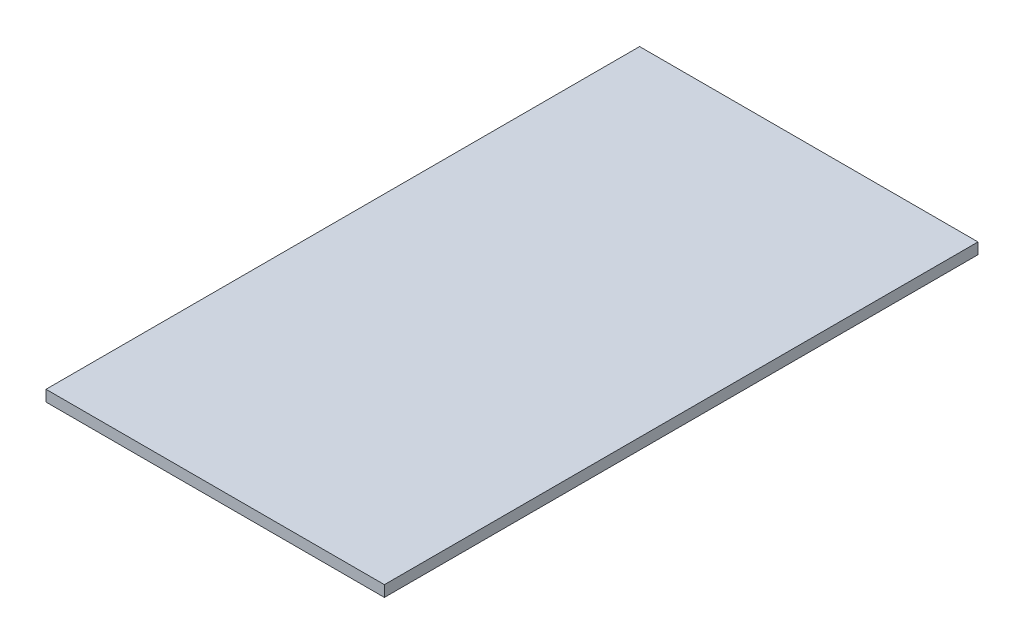
ISO-10303-21;
HEADER;
FILE_DESCRIPTION(('STEP AP214'),'2;1');
FILE_NAME('part.step','',(''),(''),'','','');
FILE_SCHEMA(('AUTOMOTIVE_DESIGN { 1 0 10303 214 1 1 1 1 }'));
ENDSEC;
DATA;
#1=APPLICATION_CONTEXT('core data for automotive mechanical design processes');
#2=APPLICATION_PROTOCOL_DEFINITION('international standard','automotive_design',2000,#1);
#3=PRODUCT_CONTEXT('',#1,'mechanical');
#4=PRODUCT('Part','Part','',(#3));
#5=PRODUCT_RELATED_PRODUCT_CATEGORY('part','',(#4));
#6=PRODUCT_DEFINITION_FORMATION('','',#4);
#7=PRODUCT_DEFINITION_CONTEXT('part definition',#1,'design');
#8=PRODUCT_DEFINITION('design','',#6,#7);
#9=PRODUCT_DEFINITION_SHAPE('','',#8);
#10=(LENGTH_UNIT() NAMED_UNIT(*) SI_UNIT(.MILLI.,.METRE.));
#11=(NAMED_UNIT(*) PLANE_ANGLE_UNIT() SI_UNIT($,.RADIAN.));
#12=(NAMED_UNIT(*) SI_UNIT($,.STERADIAN.) SOLID_ANGLE_UNIT());
#13=UNCERTAINTY_MEASURE_WITH_UNIT(LENGTH_MEASURE(1.E-05),#10,'distance_accuracy_value','');
#14=(GEOMETRIC_REPRESENTATION_CONTEXT(3) GLOBAL_UNCERTAINTY_ASSIGNED_CONTEXT((#13)) GLOBAL_UNIT_ASSIGNED_CONTEXT((#10,
#11,#12)) REPRESENTATION_CONTEXT('',''));
#15=CARTESIAN_POINT('',(0.,0.,0.));
#16=DIRECTION('',(0.,0.,1.));
#17=DIRECTION('',(1.,0.,0.));
#18=AXIS2_PLACEMENT_3D('',#15,#16,#17);
#19=CARTESIAN_POINT('',(-30.5,2.,53.5));
#20=DIRECTION('',(1.,0.,0.));
#21=DIRECTION('',(0.,0.,-1.));
#22=AXIS2_PLACEMENT_3D('',#19,#20,#21);
#23=PLANE('',#22);
#24=DIRECTION('',(0.,0.,1.));
#25=VECTOR('',#24,1.);
#26=CARTESIAN_POINT('',(-30.5,0.,53.5));
#27=LINE('',#26,#25);
#28=CARTESIAN_POINT('',(-30.5,0.,-53.5));
#29=VERTEX_POINT('',#28);
#30=CARTESIAN_POINT('',(-30.5,0.,53.5));
#31=VERTEX_POINT('',#30);
#32=EDGE_CURVE('E111',#29,#31,#27,.T.);
#33=ORIENTED_EDGE('',*,*,#32,.T.);
#34=DIRECTION('',(0.,-1.,0.));
#35=VECTOR('',#34,1.);
#36=CARTESIAN_POINT('',(-30.5,2.,53.5));
#37=LINE('',#36,#35);
#38=CARTESIAN_POINT('',(-30.5,2.,53.5));
#39=VERTEX_POINT('',#38);
#40=EDGE_CURVE('E11',#39,#31,#37,.T.);
#41=ORIENTED_EDGE('',*,*,#40,.F.);
#42=DIRECTION('',(0.,0.,1.));
#43=VECTOR('',#42,1.);
#44=CARTESIAN_POINT('',(-30.5,2.,53.5));
#45=LINE('',#44,#43);
#46=CARTESIAN_POINT('',(-30.5,2.,-53.5));
#47=VERTEX_POINT('',#46);
#48=EDGE_CURVE('E95',#47,#39,#45,.T.);
#49=ORIENTED_EDGE('',*,*,#48,.F.);
#50=DIRECTION('',(0.,-1.,0.));
#51=VECTOR('',#50,1.);
#52=CARTESIAN_POINT('',(-30.5,2.,-53.5));
#53=LINE('',#52,#51);
#54=EDGE_CURVE('E107',#47,#29,#53,.T.);
#55=ORIENTED_EDGE('',*,*,#54,.T.);
#56=EDGE_LOOP('',(#33,#41,#49,#55));
#57=FACE_BOUND('',#56,.T.);
#58=ADVANCED_FACE('F43',(#57),#23,.F.);
#59=CARTESIAN_POINT('',(30.5,2.,53.5));
#60=DIRECTION('',(0.,0.,-1.));
#61=DIRECTION('',(-1.,0.,0.));
#62=AXIS2_PLACEMENT_3D('',#59,#60,#61);
#63=PLANE('',#62);
#64=DIRECTION('',(1.,0.,0.));
#65=VECTOR('',#64,1.);
#66=CARTESIAN_POINT('',(30.5,0.,53.5));
#67=LINE('',#66,#65);
#68=CARTESIAN_POINT('',(30.5,0.,53.5));
#69=VERTEX_POINT('',#68);
#70=EDGE_CURVE('E100',#31,#69,#67,.T.);
#71=ORIENTED_EDGE('',*,*,#70,.T.);
#72=DIRECTION('',(0.,-1.,0.));
#73=VECTOR('',#72,1.);
#74=CARTESIAN_POINT('',(30.5,2.,53.5));
#75=LINE('',#74,#73);
#76=CARTESIAN_POINT('',(30.5,2.,53.5));
#77=VERTEX_POINT('',#76);
#78=EDGE_CURVE('E52',#77,#69,#75,.T.);
#79=ORIENTED_EDGE('',*,*,#78,.F.);
#80=DIRECTION('',(1.,0.,0.));
#81=VECTOR('',#80,1.);
#82=CARTESIAN_POINT('',(30.5,2.,53.5));
#83=LINE('',#82,#81);
#84=EDGE_CURVE('E90',#39,#77,#83,.T.);
#85=ORIENTED_EDGE('',*,*,#84,.F.);
#86=ORIENTED_EDGE('',*,*,#40,.T.);
#87=EDGE_LOOP('',(#71,#79,#85,#86));
#88=FACE_BOUND('',#87,.T.);
#89=ADVANCED_FACE('F99',(#88),#63,.F.);
#90=CARTESIAN_POINT('',(30.5,2.,53.5));
#91=DIRECTION('',(-1.,0.,0.));
#92=DIRECTION('',(0.,0.,1.));
#93=AXIS2_PLACEMENT_3D('',#90,#91,#92);
#94=PLANE('',#93);
#95=DIRECTION('',(0.,0.,-1.));
#96=VECTOR('',#95,1.);
#97=CARTESIAN_POINT('',(30.5,0.,53.5));
#98=LINE('',#97,#96);
#99=CARTESIAN_POINT('',(30.5,0.,-53.5));
#100=VERTEX_POINT('',#99);
#101=EDGE_CURVE('E77',#69,#100,#98,.T.);
#102=ORIENTED_EDGE('',*,*,#101,.T.);
#103=DIRECTION('',(0.,-1.,0.));
#104=VECTOR('',#103,1.);
#105=CARTESIAN_POINT('',(30.5,2.,-53.5));
#106=LINE('',#105,#104);
#107=CARTESIAN_POINT('',(30.5,2.,-53.5));
#108=VERTEX_POINT('',#107);
#109=EDGE_CURVE('E102',#108,#100,#106,.T.);
#110=ORIENTED_EDGE('',*,*,#109,.F.);
#111=DIRECTION('',(0.,0.,-1.));
#112=VECTOR('',#111,1.);
#113=CARTESIAN_POINT('',(30.5,2.,53.5));
#114=LINE('',#113,#112);
#115=EDGE_CURVE('E93',#77,#108,#114,.T.);
#116=ORIENTED_EDGE('',*,*,#115,.F.);
#117=ORIENTED_EDGE('',*,*,#78,.T.);
#118=EDGE_LOOP('',(#102,#110,#116,#117));
#119=FACE_BOUND('',#118,.T.);
#120=ADVANCED_FACE('F103',(#119),#94,.F.);
#121=CARTESIAN_POINT('',(30.5,2.,-53.5));
#122=DIRECTION('',(0.,0.,1.));
#123=DIRECTION('',(1.,0.,0.));
#124=AXIS2_PLACEMENT_3D('',#121,#122,#123);
#125=PLANE('',#124);
#126=DIRECTION('',(-1.,0.,0.));
#127=VECTOR('',#126,1.);
#128=CARTESIAN_POINT('',(30.5,0.,-53.5));
#129=LINE('',#128,#127);
#130=EDGE_CURVE('E83',#100,#29,#129,.T.);
#131=ORIENTED_EDGE('',*,*,#130,.T.);
#132=ORIENTED_EDGE('',*,*,#54,.F.);
#133=DIRECTION('',(-1.,0.,0.));
#134=VECTOR('',#133,1.);
#135=CARTESIAN_POINT('',(30.5,2.,-53.5));
#136=LINE('',#135,#134);
#137=EDGE_CURVE('E60',#108,#47,#136,.T.);
#138=ORIENTED_EDGE('',*,*,#137,.F.);
#139=ORIENTED_EDGE('',*,*,#109,.T.);
#140=EDGE_LOOP('',(#131,#132,#138,#139));
#141=FACE_BOUND('',#140,.T.);
#142=ADVANCED_FACE('F124',(#141),#125,.F.);
#143=CARTESIAN_POINT('',(0.,2.,0.));
#144=DIRECTION('',(0.,1.,0.));
#145=DIRECTION('',(0.,0.,1.));
#146=AXIS2_PLACEMENT_3D('',#143,#144,#145);
#147=PLANE('',#146);
#148=ORIENTED_EDGE('',*,*,#48,.T.);
#149=ORIENTED_EDGE('',*,*,#84,.T.);
#150=ORIENTED_EDGE('',*,*,#115,.T.);
#151=ORIENTED_EDGE('',*,*,#137,.T.);
#152=EDGE_LOOP('',(#148,#149,#150,#151));
#153=FACE_BOUND('',#152,.T.);
#154=ADVANCED_FACE('F91',(#153),#147,.T.);
#155=CARTESIAN_POINT('',(0.,0.,0.));
#156=DIRECTION('',(0.,1.,0.));
#157=DIRECTION('',(0.,0.,1.));
#158=AXIS2_PLACEMENT_3D('',#155,#156,#157);
#159=PLANE('',#158);
#160=ORIENTED_EDGE('',*,*,#32,.F.);
#161=ORIENTED_EDGE('',*,*,#130,.F.);
#162=ORIENTED_EDGE('',*,*,#101,.F.);
#163=ORIENTED_EDGE('',*,*,#70,.F.);
#164=EDGE_LOOP('',(#160,#161,#162,#163));
#165=FACE_BOUND('',#164,.T.);
#166=ADVANCED_FACE('F127',(#165),#159,.F.);
#167=CLOSED_SHELL('',(#58,#89,#120,#142,#154,#166));
#168=MANIFOLD_SOLID_BREP('B2',#167);
#169=ADVANCED_BREP_SHAPE_REPRESENTATION('',(#18,#168),#14);
#170=SHAPE_DEFINITION_REPRESENTATION(#9,#169);
ENDSEC;
END-ISO-10303-21;
